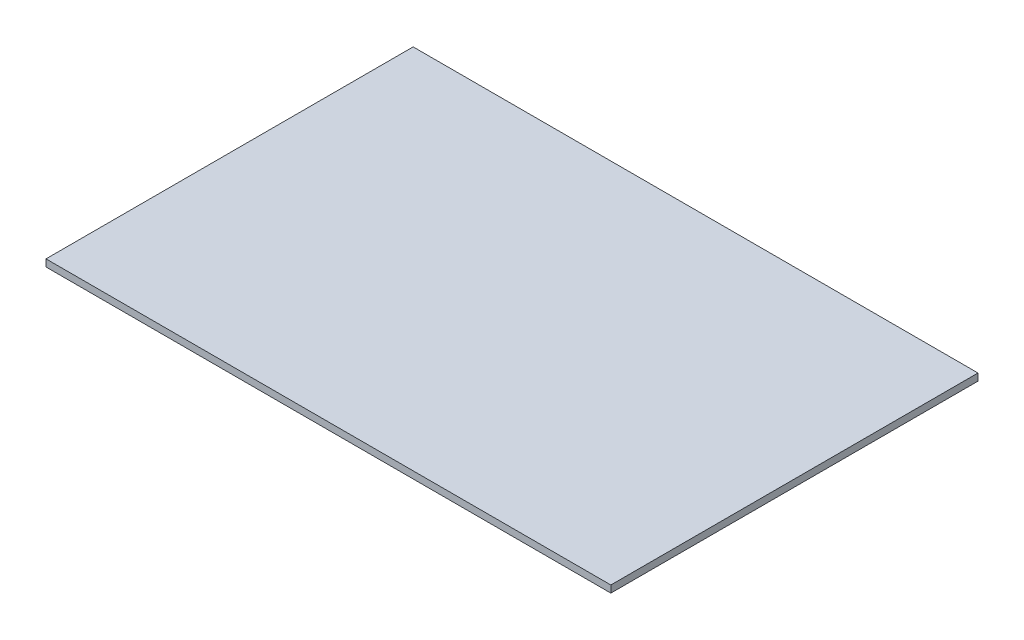
ISO-10303-21;
HEADER;
FILE_DESCRIPTION(('STEP AP214'),'2;1');
FILE_NAME('part.step','',(''),(''),'','','');
FILE_SCHEMA(('AUTOMOTIVE_DESIGN { 1 0 10303 214 1 1 1 1 }'));
ENDSEC;
DATA;
#1=APPLICATION_CONTEXT('core data for automotive mechanical design processes');
#2=APPLICATION_PROTOCOL_DEFINITION('international standard','automotive_design',2000,#1);
#3=PRODUCT_CONTEXT('',#1,'mechanical');
#4=PRODUCT('Part','Part','',(#3));
#5=PRODUCT_RELATED_PRODUCT_CATEGORY('part','',(#4));
#6=PRODUCT_DEFINITION_FORMATION('','',#4);
#7=PRODUCT_DEFINITION_CONTEXT('part definition',#1,'design');
#8=PRODUCT_DEFINITION('design','',#6,#7);
#9=PRODUCT_DEFINITION_SHAPE('','',#8);
#10=(LENGTH_UNIT() NAMED_UNIT(*) SI_UNIT(.MILLI.,.METRE.));
#11=(NAMED_UNIT(*) PLANE_ANGLE_UNIT() SI_UNIT($,.RADIAN.));
#12=(NAMED_UNIT(*) SI_UNIT($,.STERADIAN.) SOLID_ANGLE_UNIT());
#13=UNCERTAINTY_MEASURE_WITH_UNIT(LENGTH_MEASURE(1.E-05),#10,'distance_accuracy_value','');
#14=(GEOMETRIC_REPRESENTATION_CONTEXT(3) GLOBAL_UNCERTAINTY_ASSIGNED_CONTEXT((#13)) GLOBAL_UNIT_ASSIGNED_CONTEXT((#10,
#11,#12)) REPRESENTATION_CONTEXT('',''));
#15=CARTESIAN_POINT('',(0.,0.,0.));
#16=DIRECTION('',(0.,0.,1.));
#17=DIRECTION('',(1.,0.,0.));
#18=AXIS2_PLACEMENT_3D('',#15,#16,#17);
#19=CARTESIAN_POINT('',(0.,1.5,0.));
#20=DIRECTION('',(1.,0.,0.));
#21=DIRECTION('',(0.,0.,-1.));
#22=AXIS2_PLACEMENT_3D('',#19,#20,#21);
#23=PLANE('',#22);
#24=DIRECTION('',(0.,0.,1.));
#25=VECTOR('',#24,1.);
#26=CARTESIAN_POINT('',(0.,0.,0.));
#27=LINE('',#26,#25);
#28=CARTESIAN_POINT('',(0.,0.,-78.));
#29=VERTEX_POINT('',#28);
#30=CARTESIAN_POINT('',(0.,0.,0.));
#31=VERTEX_POINT('',#30);
#32=EDGE_CURVE('E107',#29,#31,#27,.T.);
#33=ORIENTED_EDGE('',*,*,#32,.T.);
#34=DIRECTION('',(0.,-1.,0.));
#35=VECTOR('',#34,1.);
#36=CARTESIAN_POINT('',(0.,1.5,0.));
#37=LINE('',#36,#35);
#38=CARTESIAN_POINT('',(0.,1.5,0.));
#39=VERTEX_POINT('',#38);
#40=EDGE_CURVE('E11',#39,#31,#37,.T.);
#41=ORIENTED_EDGE('',*,*,#40,.F.);
#42=DIRECTION('',(0.,0.,1.));
#43=VECTOR('',#42,1.);
#44=CARTESIAN_POINT('',(0.,1.5,0.));
#45=LINE('',#44,#43);
#46=CARTESIAN_POINT('',(0.,1.5,-78.));
#47=VERTEX_POINT('',#46);
#48=EDGE_CURVE('E91',#47,#39,#45,.T.);
#49=ORIENTED_EDGE('',*,*,#48,.F.);
#50=DIRECTION('',(0.,-1.,0.));
#51=VECTOR('',#50,1.);
#52=CARTESIAN_POINT('',(0.,1.5,-78.));
#53=LINE('',#52,#51);
#54=EDGE_CURVE('E103',#47,#29,#53,.T.);
#55=ORIENTED_EDGE('',*,*,#54,.T.);
#56=EDGE_LOOP('',(#33,#41,#49,#55));
#57=FACE_BOUND('',#56,.T.);
#58=ADVANCED_FACE('F39',(#57),#23,.F.);
#59=CARTESIAN_POINT('',(0.,1.5,0.));
#60=DIRECTION('',(0.,0.,-1.));
#61=DIRECTION('',(-1.,0.,0.));
#62=AXIS2_PLACEMENT_3D('',#59,#60,#61);
#63=PLANE('',#62);
#64=DIRECTION('',(1.,0.,0.));
#65=VECTOR('',#64,1.);
#66=CARTESIAN_POINT('',(0.,0.,0.));
#67=LINE('',#66,#65);
#68=CARTESIAN_POINT('',(120.,0.,0.));
#69=VERTEX_POINT('',#68);
#70=EDGE_CURVE('E96',#31,#69,#67,.T.);
#71=ORIENTED_EDGE('',*,*,#70,.T.);
#72=DIRECTION('',(0.,-1.,0.));
#73=VECTOR('',#72,1.);
#74=CARTESIAN_POINT('',(120.,1.5,0.));
#75=LINE('',#74,#73);
#76=CARTESIAN_POINT('',(120.,1.5,0.));
#77=VERTEX_POINT('',#76);
#78=EDGE_CURVE('E48',#77,#69,#75,.T.);
#79=ORIENTED_EDGE('',*,*,#78,.F.);
#80=DIRECTION('',(1.,0.,0.));
#81=VECTOR('',#80,1.);
#82=CARTESIAN_POINT('',(0.,1.5,0.));
#83=LINE('',#82,#81);
#84=EDGE_CURVE('E86',#39,#77,#83,.T.);
#85=ORIENTED_EDGE('',*,*,#84,.F.);
#86=ORIENTED_EDGE('',*,*,#40,.T.);
#87=EDGE_LOOP('',(#71,#79,#85,#86));
#88=FACE_BOUND('',#87,.T.);
#89=ADVANCED_FACE('F95',(#88),#63,.F.);
#90=CARTESIAN_POINT('',(120.,1.5,0.));
#91=DIRECTION('',(-1.,0.,0.));
#92=DIRECTION('',(0.,0.,1.));
#93=AXIS2_PLACEMENT_3D('',#90,#91,#92);
#94=PLANE('',#93);
#95=DIRECTION('',(0.,0.,-1.));
#96=VECTOR('',#95,1.);
#97=CARTESIAN_POINT('',(120.,0.,0.));
#98=LINE('',#97,#96);
#99=CARTESIAN_POINT('',(120.,0.,-78.));
#100=VERTEX_POINT('',#99);
#101=EDGE_CURVE('E73',#69,#100,#98,.T.);
#102=ORIENTED_EDGE('',*,*,#101,.T.);
#103=DIRECTION('',(0.,-1.,0.));
#104=VECTOR('',#103,1.);
#105=CARTESIAN_POINT('',(120.,1.5,-78.));
#106=LINE('',#105,#104);
#107=CARTESIAN_POINT('',(120.,1.5,-78.));
#108=VERTEX_POINT('',#107);
#109=EDGE_CURVE('E98',#108,#100,#106,.T.);
#110=ORIENTED_EDGE('',*,*,#109,.F.);
#111=DIRECTION('',(0.,0.,-1.));
#112=VECTOR('',#111,1.);
#113=CARTESIAN_POINT('',(120.,1.5,0.));
#114=LINE('',#113,#112);
#115=EDGE_CURVE('E89',#77,#108,#114,.T.);
#116=ORIENTED_EDGE('',*,*,#115,.F.);
#117=ORIENTED_EDGE('',*,*,#78,.T.);
#118=EDGE_LOOP('',(#102,#110,#116,#117));
#119=FACE_BOUND('',#118,.T.);
#120=ADVANCED_FACE('F99',(#119),#94,.F.);
#121=CARTESIAN_POINT('',(0.,1.5,-78.));
#122=DIRECTION('',(0.,0.,1.));
#123=DIRECTION('',(1.,0.,0.));
#124=AXIS2_PLACEMENT_3D('',#121,#122,#123);
#125=PLANE('',#124);
#126=DIRECTION('',(-1.,0.,0.));
#127=VECTOR('',#126,1.);
#128=CARTESIAN_POINT('',(0.,0.,-78.));
#129=LINE('',#128,#127);
#130=EDGE_CURVE('E79',#100,#29,#129,.T.);
#131=ORIENTED_EDGE('',*,*,#130,.T.);
#132=ORIENTED_EDGE('',*,*,#54,.F.);
#133=DIRECTION('',(-1.,0.,0.));
#134=VECTOR('',#133,1.);
#135=CARTESIAN_POINT('',(0.,1.5,-78.));
#136=LINE('',#135,#134);
#137=EDGE_CURVE('E56',#108,#47,#136,.T.);
#138=ORIENTED_EDGE('',*,*,#137,.F.);
#139=ORIENTED_EDGE('',*,*,#109,.T.);
#140=EDGE_LOOP('',(#131,#132,#138,#139));
#141=FACE_BOUND('',#140,.T.);
#142=ADVANCED_FACE('F120',(#141),#125,.F.);
#143=CARTESIAN_POINT('',(0.,1.5,0.));
#144=DIRECTION('',(0.,-1.,0.));
#145=DIRECTION('',(0.,0.,-1.));
#146=AXIS2_PLACEMENT_3D('',#143,#144,#145);
#147=PLANE('',#146);
#148=ORIENTED_EDGE('',*,*,#48,.T.);
#149=ORIENTED_EDGE('',*,*,#84,.T.);
#150=ORIENTED_EDGE('',*,*,#115,.T.);
#151=ORIENTED_EDGE('',*,*,#137,.T.);
#152=EDGE_LOOP('',(#148,#149,#150,#151));
#153=FACE_BOUND('',#152,.T.);
#154=ADVANCED_FACE('F87',(#153),#147,.F.);
#155=CARTESIAN_POINT('',(0.,0.,0.));
#156=DIRECTION('',(0.,-1.,0.));
#157=DIRECTION('',(0.,0.,-1.));
#158=AXIS2_PLACEMENT_3D('',#155,#156,#157);
#159=PLANE('',#158);
#160=ORIENTED_EDGE('',*,*,#32,.F.);
#161=ORIENTED_EDGE('',*,*,#130,.F.);
#162=ORIENTED_EDGE('',*,*,#101,.F.);
#163=ORIENTED_EDGE('',*,*,#70,.F.);
#164=EDGE_LOOP('',(#160,#161,#162,#163));
#165=FACE_BOUND('',#164,.T.);
#166=ADVANCED_FACE('F123',(#165),#159,.T.);
#167=CLOSED_SHELL('',(#58,#89,#120,#142,#154,#166));
#168=MANIFOLD_SOLID_BREP('B2',#167);
#169=ADVANCED_BREP_SHAPE_REPRESENTATION('',(#18,#168),#14);
#170=SHAPE_DEFINITION_REPRESENTATION(#9,#169);
ENDSEC;
END-ISO-10303-21;
